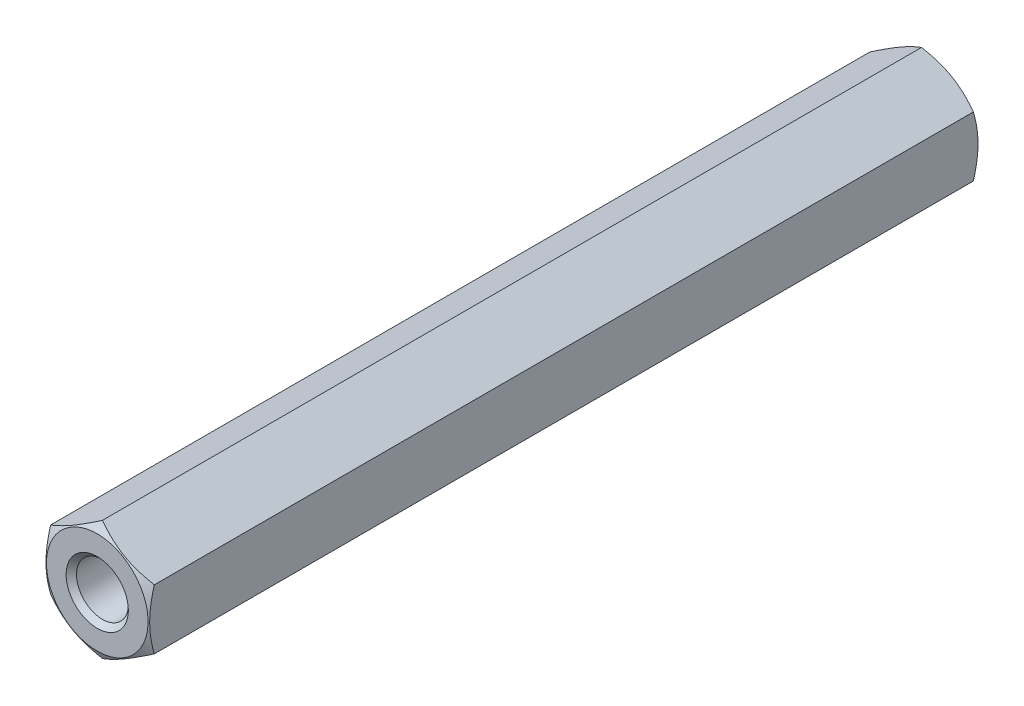
ISO-10303-21;
HEADER;
FILE_DESCRIPTION(('STEP AP214'),'2;1');
FILE_NAME('part.step','',(''),(''),'','','');
FILE_SCHEMA(('AUTOMOTIVE_DESIGN { 1 0 10303 214 1 1 1 1 }'));
ENDSEC;
DATA;
#1=APPLICATION_CONTEXT('core data for automotive mechanical design processes');
#2=APPLICATION_PROTOCOL_DEFINITION('international standard','automotive_design',2000,#1);
#3=PRODUCT_CONTEXT('',#1,'mechanical');
#4=PRODUCT('Part','Part','',(#3));
#5=PRODUCT_RELATED_PRODUCT_CATEGORY('part','',(#4));
#6=PRODUCT_DEFINITION_FORMATION('','',#4);
#7=PRODUCT_DEFINITION_CONTEXT('part definition',#1,'design');
#8=PRODUCT_DEFINITION('design','',#6,#7);
#9=PRODUCT_DEFINITION_SHAPE('','',#8);
#10=(LENGTH_UNIT() NAMED_UNIT(*) SI_UNIT(.MILLI.,.METRE.));
#11=(NAMED_UNIT(*) PLANE_ANGLE_UNIT() SI_UNIT($,.RADIAN.));
#12=(NAMED_UNIT(*) SI_UNIT($,.STERADIAN.) SOLID_ANGLE_UNIT());
#13=UNCERTAINTY_MEASURE_WITH_UNIT(LENGTH_MEASURE(1.E-05),#10,'distance_accuracy_value','');
#14=(GEOMETRIC_REPRESENTATION_CONTEXT(3) GLOBAL_UNCERTAINTY_ASSIGNED_CONTEXT((#13)) GLOBAL_UNIT_ASSIGNED_CONTEXT((#10,
#11,#12)) REPRESENTATION_CONTEXT('',''));
#15=CARTESIAN_POINT('',(0.,0.,0.));
#16=DIRECTION('',(0.,0.,1.));
#17=DIRECTION('',(1.,0.,0.));
#18=AXIS2_PLACEMENT_3D('',#15,#16,#17);
#19=CARTESIAN_POINT('',(0.,0.,0.));
#20=DIRECTION('',(0.,0.,1.));
#21=DIRECTION('',(1.,0.,0.));
#22=AXIS2_PLACEMENT_3D('',#19,#20,#21);
#23=PLANE('',#22);
#24=CARTESIAN_POINT('',(0.,0.,0.));
#25=DIRECTION('',(0.,0.,-1.));
#26=DIRECTION('',(1.,0.,0.));
#27=AXIS2_PLACEMENT_3D('',#24,#25,#26);
#28=CIRCLE('',#27,3.);
#29=CARTESIAN_POINT('',(3.,0.,0.));
#30=VERTEX_POINT('',#29);
#31=EDGE_CURVE('E177',#30,#30,#28,.T.);
#32=ORIENTED_EDGE('',*,*,#31,.T.);
#33=EDGE_LOOP('',(#32));
#34=FACE_BOUND('',#33,.T.);
#35=CARTESIAN_POINT('',(0.,0.,0.));
#36=DIRECTION('',(0.,0.,1.));
#37=DIRECTION('',(1.,0.,0.));
#38=AXIS2_PLACEMENT_3D('',#35,#36,#37);
#39=CIRCLE('',#38,4.9);
#40=CARTESIAN_POINT('',(-4.9,0.,0.));
#41=VERTEX_POINT('',#40);
#42=EDGE_CURVE('E169',#41,#41,#39,.T.);
#43=ORIENTED_EDGE('',*,*,#42,.T.);
#44=EDGE_LOOP('',(#43));
#45=FACE_BOUND('',#44,.T.);
#46=ADVANCED_FACE('F16',(#34,#45),#23,.T.);
#47=CARTESIAN_POINT('',(0.,5.77350269189626,-80.));
#48=DIRECTION('',(-0.5,0.866025403784439,0.));
#49=DIRECTION('',(0.,0.,1.));
#50=AXIS2_PLACEMENT_3D('',#47,#48,#49);
#51=PLANE('',#50);
#52=DIRECTION('',(0.,0.,1.));
#53=VECTOR('',#52,1.);
#54=CARTESIAN_POINT('',(-5.,2.88675134594813,-80.));
#55=LINE('',#54,#53);
#56=CARTESIAN_POINT('',(-5.,2.88675134594813,-79.4956829856958));
#57=VERTEX_POINT('',#56);
#58=CARTESIAN_POINT('',(-5.,2.88675134594813,-0.504317014304161));
#59=VERTEX_POINT('',#58);
#60=EDGE_CURVE('E11',#57,#59,#55,.T.);
#61=ORIENTED_EDGE('',*,*,#60,.T.);
#62=CARTESIAN_POINT('',(-5.,2.88675134594813,-0.504317014304201));
#63=CARTESIAN_POINT('',(-3.66306980544847,3.65862835366019,-0.0586736161190954));
#64=CARTESIAN_POINT('',(-2.50477576908249,4.32736972735683,-0.057736782676801));
#65=CARTESIAN_POINT('',(-1.88471942439267,4.68535942487623,-0.0572352783077962));
#66=CARTESIAN_POINT('',(-1.237931285487,5.05878273098208,-0.177851186469402));
#67=CARTESIAN_POINT('',(-0.651083691509377,5.39759934733835,-0.287289117133799));
#68=CARTESIAN_POINT('',(0.,5.77350269189626,-0.504317014304201));
#69=B_SPLINE_CURVE_WITH_KNOTS('',2,(#62,#63,#64,#65,#66,#67,#68),.UNSPECIFIED.,.F.,.F.,(3,2,2,
3),(0.,0.5,0.75,1.),.UNSPECIFIED.);
#70=CARTESIAN_POINT('',(0.,5.77350269189626,-0.504317014304161));
#71=VERTEX_POINT('',#70);
#72=EDGE_CURVE('E185',#59,#71,#69,.T.);
#73=ORIENTED_EDGE('',*,*,#72,.T.);
#74=DIRECTION('',(0.,0.,1.));
#75=VECTOR('',#74,1.);
#76=CARTESIAN_POINT('',(0.,5.77350269189626,-80.));
#77=LINE('',#76,#75);
#78=CARTESIAN_POINT('',(0.,5.77350269189626,-79.4956829856958));
#79=VERTEX_POINT('',#78);
#80=EDGE_CURVE('E45',#79,#71,#77,.T.);
#81=ORIENTED_EDGE('',*,*,#80,.F.);
#82=CARTESIAN_POINT('',(0.,5.77350269189626,-79.4956829856958));
#83=CARTESIAN_POINT('',(-1.33693019455178,5.00162568418405,-79.9413263838809));
#84=CARTESIAN_POINT('',(-2.49522423091751,4.33288431048756,-79.9422632173232));
#85=CARTESIAN_POINT('',(-3.11528057540677,3.97489461308395,-79.942764721692));
#86=CARTESIAN_POINT('',(-3.762068714513,3.60147130686231,-79.8221488135306));
#87=CARTESIAN_POINT('',(-4.34891630825725,3.26265469064078,-79.7127108829439));
#88=CARTESIAN_POINT('',(-5.,2.88675134594813,-79.4956829856958));
#89=B_SPLINE_CURVE_WITH_KNOTS('',2,(#82,#83,#84,#85,#86,#87,#88),.UNSPECIFIED.,.F.,.F.,(3,2,2,
3),(0.,0.5,0.75,1.),.UNSPECIFIED.);
#90=EDGE_CURVE('E387',#79,#57,#89,.T.);
#91=ORIENTED_EDGE('',*,*,#90,.T.);
#92=EDGE_LOOP('',(#61,#73,#81,#91));
#93=FACE_BOUND('',#92,.T.);
#94=ADVANCED_FACE('F303',(#93),#51,.T.);
#95=CARTESIAN_POINT('',(-5.,2.88675134594813,-80.));
#96=DIRECTION('',(-1.,0.,0.));
#97=DIRECTION('',(0.,0.,1.));
#98=AXIS2_PLACEMENT_3D('',#95,#96,#97);
#99=PLANE('',#98);
#100=DIRECTION('',(0.,0.,1.));
#101=VECTOR('',#100,1.);
#102=CARTESIAN_POINT('',(-5.,-2.88675134594813,-80.));
#103=LINE('',#102,#101);
#104=CARTESIAN_POINT('',(-5.,-2.88675134594813,-79.4956829856958));
#105=VERTEX_POINT('',#104);
#106=CARTESIAN_POINT('',(-5.,-2.88675134594813,-0.50431701430416));
#107=VERTEX_POINT('',#106);
#108=EDGE_CURVE('E30',#105,#107,#103,.T.);
#109=ORIENTED_EDGE('',*,*,#108,.T.);
#110=CARTESIAN_POINT('',(-5.,-2.88675134594813,-0.504317014304201));
#111=CARTESIAN_POINT('',(-5.,-2.13397543139319,-0.287009325850199));
#112=CARTESIAN_POINT('',(-5.,-1.4544658785629,-0.177391891882109));
#113=CARTESIAN_POINT('',(-5.,-0.712722709973745,-0.0577350269189009));
#114=CARTESIAN_POINT('',(-5.,0.,-0.0577350269189009));
#115=B_SPLINE_CURVE_WITH_KNOTS('',2,(#110,#111,#112,#113,#114),.UNSPECIFIED.,.F.,.F.,(3,2,3),
(0.,0.5,1.),.UNSPECIFIED.);
#116=CARTESIAN_POINT('',(-5.,0.,-0.0577350269189619));
#117=VERTEX_POINT('',#116);
#118=EDGE_CURVE('E325',#107,#117,#115,.T.);
#119=ORIENTED_EDGE('',*,*,#118,.T.);
#120=CARTESIAN_POINT('',(-5.,0.,-0.0577350269189009));
#121=CARTESIAN_POINT('',(-5.,0.71724152943844,-0.0577350269189009));
#122=CARTESIAN_POINT('',(-5.,1.46517966914249,-0.179125491838406));
#123=CARTESIAN_POINT('',(-5.,2.13921232145819,-0.288521085794607));
#124=CARTESIAN_POINT('',(-5.,2.88675134594813,-0.504317014304201));
#125=B_SPLINE_CURVE_WITH_KNOTS('',2,(#120,#121,#122,#123,#124),.UNSPECIFIED.,.F.,.F.,(3,2,3),
(0.,0.5,1.),.UNSPECIFIED.);
#126=EDGE_CURVE('E290',#117,#59,#125,.T.);
#127=ORIENTED_EDGE('',*,*,#126,.T.);
#128=ORIENTED_EDGE('',*,*,#60,.F.);
#129=CARTESIAN_POINT('',(-5.,2.88675134594813,-79.4956829856958));
#130=CARTESIAN_POINT('',(-5.,2.13980606328878,-79.7113075157026));
#131=CARTESIAN_POINT('',(-5.,1.46517966914249,-79.8208745081617));
#132=CARTESIAN_POINT('',(-5.,0.717753735525175,-79.9422649730811));
#133=CARTESIAN_POINT('',(-5.,0.,-79.9422649730811));
#134=B_SPLINE_CURVE_WITH_KNOTS('',2,(#129,#130,#131,#132,#133),.UNSPECIFIED.,.F.,.F.,(3,2,3),
(0.,0.5,1.),.UNSPECIFIED.);
#135=CARTESIAN_POINT('',(-5.,0.,-79.9422649730811));
#136=VERTEX_POINT('',#135);
#137=EDGE_CURVE('E726',#57,#136,#134,.T.);
#138=ORIENTED_EDGE('',*,*,#137,.T.);
#139=CARTESIAN_POINT('',(-5.,0.,-79.9422649730811));
#140=CARTESIAN_POINT('',(-5.,-0.71221031795662,-79.9422649730811));
#141=CARTESIAN_POINT('',(-5.,-1.45446587856291,-79.8226081081179));
#142=CARTESIAN_POINT('',(-5.,-2.13338178582431,-79.7131620448642));
#143=CARTESIAN_POINT('',(-5.,-2.88675134594813,-79.4956829856958));
#144=B_SPLINE_CURVE_WITH_KNOTS('',2,(#139,#140,#141,#142,#143),.UNSPECIFIED.,.F.,.F.,(3,2,3),
(0.,0.5,1.),.UNSPECIFIED.);
#145=EDGE_CURVE('E728',#136,#105,#144,.T.);
#146=ORIENTED_EDGE('',*,*,#145,.T.);
#147=EDGE_LOOP('',(#109,#119,#127,#128,#138,#146));
#148=FACE_BOUND('',#147,.T.);
#149=ADVANCED_FACE('F293',(#148),#99,.T.);
#150=CARTESIAN_POINT('',(-5.,-2.88675134594813,-80.));
#151=DIRECTION('',(-0.5,-0.866025403784439,0.));
#152=DIRECTION('',(-0.866025403784439,0.5,0.));
#153=AXIS2_PLACEMENT_3D('',#150,#151,#152);
#154=PLANE('',#153);
#155=DIRECTION('',(0.,0.,1.));
#156=VECTOR('',#155,1.);
#157=CARTESIAN_POINT('',(0.,-5.77350269189626,-80.));
#158=LINE('',#157,#156);
#159=CARTESIAN_POINT('',(0.,-5.77350269189626,-79.4956829856958));
#160=VERTEX_POINT('',#159);
#161=CARTESIAN_POINT('',(0.,-5.77350269189626,-0.504317014304161));
#162=VERTEX_POINT('',#161);
#163=EDGE_CURVE('E392',#160,#162,#158,.T.);
#164=ORIENTED_EDGE('',*,*,#163,.T.);
#165=CARTESIAN_POINT('',(0.,-5.77350269189626,-0.504317014304159));
#166=CARTESIAN_POINT('',(-1.33693019455152,-5.0016256841842,-0.0586736161190538));
#167=CARTESIAN_POINT('',(-2.49522423091751,-4.33288431048756,-0.0577367826767594));
#168=CARTESIAN_POINT('',(-3.11528057561013,-3.97489461296654,-0.0572352783077545));
#169=CARTESIAN_POINT('',(-3.762068714513,-3.60147130686231,-0.17785118646936));
#170=CARTESIAN_POINT('',(-4.34891630849387,-3.26265469050417,-0.287289117134853));
#171=CARTESIAN_POINT('',(-5.,-2.88675134594813,-0.504317014304159));
#172=B_SPLINE_CURVE_WITH_KNOTS('',2,(#165,#166,#167,#168,#169,#170,#171),.UNSPECIFIED.,.F.,.F.,
(3,2,2,3),(0.,0.5,0.75,1.),.UNSPECIFIED.);
#173=EDGE_CURVE('E330',#162,#107,#172,.T.);
#174=ORIENTED_EDGE('',*,*,#173,.T.);
#175=ORIENTED_EDGE('',*,*,#108,.F.);
#176=CARTESIAN_POINT('',(-5.,-2.88675134594813,-79.4956829856958));
#177=CARTESIAN_POINT('',(-3.66306980550131,-3.65862835362969,-79.9413263838634));
#178=CARTESIAN_POINT('',(-2.50477576908249,-4.32736972735683,-79.9422632173232));
#179=CARTESIAN_POINT('',(-1.88471942456989,-4.68535942477392,-79.9427647217014));
#180=CARTESIAN_POINT('',(-1.237931285487,-5.05878273098208,-79.8221488135306));
#181=CARTESIAN_POINT('',(-0.651083691656496,-5.3975993472534,-79.7127108829153));
#182=CARTESIAN_POINT('',(0.,-5.77350269189626,-79.4956829856958));
#183=B_SPLINE_CURVE_WITH_KNOTS('',2,(#176,#177,#178,#179,#180,#181,#182),.UNSPECIFIED.,.F.,.F.,
(3,2,2,3),(0.,0.5,0.75,1.),.UNSPECIFIED.);
#184=EDGE_CURVE('E735',#105,#160,#183,.T.);
#185=ORIENTED_EDGE('',*,*,#184,.T.);
#186=EDGE_LOOP('',(#164,#174,#175,#185));
#187=FACE_BOUND('',#186,.T.);
#188=ADVANCED_FACE('F302',(#187),#154,.T.);
#189=CARTESIAN_POINT('',(0.,-5.77350269189626,-80.));
#190=DIRECTION('',(0.5,-0.866025403784439,0.));
#191=DIRECTION('',(0.,0.,-1.));
#192=AXIS2_PLACEMENT_3D('',#189,#190,#191);
#193=PLANE('',#192);
#194=DIRECTION('',(0.,0.,1.));
#195=VECTOR('',#194,1.);
#196=CARTESIAN_POINT('',(5.,-2.88675134594813,-80.));
#197=LINE('',#196,#195);
#198=CARTESIAN_POINT('',(5.,-2.88675134594813,-79.4956829856958));
#199=VERTEX_POINT('',#198);
#200=CARTESIAN_POINT('',(5.,-2.88675134594813,-0.50431701430416));
#201=VERTEX_POINT('',#200);
#202=EDGE_CURVE('E396',#199,#201,#197,.T.);
#203=ORIENTED_EDGE('',*,*,#202,.T.);
#204=CARTESIAN_POINT('',(5.,-2.88675134594813,-0.504317014304201));
#205=CARTESIAN_POINT('',(3.66306980544847,-3.6586283536602,-0.0586736161190954));
#206=CARTESIAN_POINT('',(2.50477576908249,-4.32736972735683,-0.057736782676801));
#207=CARTESIAN_POINT('',(1.88471942438946,-4.68535942487809,-0.0572352783077962));
#208=CARTESIAN_POINT('',(1.237931285487,-5.05878273098208,-0.177851186469402));
#209=CARTESIAN_POINT('',(0.651083691505648,-5.3975993473405,-0.287289117134992));
#210=CARTESIAN_POINT('',(0.,-5.77350269189626,-0.504317014304201));
#211=B_SPLINE_CURVE_WITH_KNOTS('',2,(#204,#205,#206,#207,#208,#209,#210),.UNSPECIFIED.,.F.,.F.,
(3,2,2,3),(0.,0.5,0.75,1.),.UNSPECIFIED.);
#212=EDGE_CURVE('E870',#201,#162,#211,.T.);
#213=ORIENTED_EDGE('',*,*,#212,.T.);
#214=ORIENTED_EDGE('',*,*,#163,.F.);
#215=CARTESIAN_POINT('',(0.,-5.77350269189626,-79.4956829856958));
#216=CARTESIAN_POINT('',(1.3369301945518,-5.00162568418404,-79.9413263838809));
#217=CARTESIAN_POINT('',(2.49522423091751,-4.33288431048756,-79.9422632173232));
#218=CARTESIAN_POINT('',(3.11528057545602,-3.97489461305551,-79.942764721692));
#219=CARTESIAN_POINT('',(3.762068714513,-3.60147130686231,-79.8221488135306));
#220=CARTESIAN_POINT('',(4.34891630831441,-3.26265469060778,-79.7127108829249));
#221=CARTESIAN_POINT('',(5.,-2.88675134594813,-79.4956829856958));
#222=B_SPLINE_CURVE_WITH_KNOTS('',2,(#215,#216,#217,#218,#219,#220,#221),.UNSPECIFIED.,.F.,.F.,
(3,2,2,3),(0.,0.5,0.75,1.),.UNSPECIFIED.);
#223=EDGE_CURVE('E839',#160,#199,#222,.T.);
#224=ORIENTED_EDGE('',*,*,#223,.T.);
#225=EDGE_LOOP('',(#203,#213,#214,#224));
#226=FACE_BOUND('',#225,.T.);
#227=ADVANCED_FACE('F18',(#226),#193,.T.);
#228=CARTESIAN_POINT('',(5.,-2.88675134594813,-80.));
#229=DIRECTION('',(1.,0.,0.));
#230=DIRECTION('',(0.,1.,0.));
#231=AXIS2_PLACEMENT_3D('',#228,#229,#230);
#232=PLANE('',#231);
#233=DIRECTION('',(0.,0.,1.));
#234=VECTOR('',#233,1.);
#235=CARTESIAN_POINT('',(5.,2.88675134594813,-80.));
#236=LINE('',#235,#234);
#237=CARTESIAN_POINT('',(5.,2.88675134594813,-79.4956829856958));
#238=VERTEX_POINT('',#237);
#239=CARTESIAN_POINT('',(5.,2.88675134594813,-0.50431701430416));
#240=VERTEX_POINT('',#239);
#241=EDGE_CURVE('E105',#238,#240,#236,.T.);
#242=ORIENTED_EDGE('',*,*,#241,.T.);
#243=CARTESIAN_POINT('',(5.,2.88675134594813,-0.504317014304201));
#244=CARTESIAN_POINT('',(5.,2.13980606328883,-0.288692484297512));
#245=CARTESIAN_POINT('',(5.,1.46517966914249,-0.179125491838406));
#246=CARTESIAN_POINT('',(5.,0.717753735525955,-0.0577350269189009));
#247=CARTESIAN_POINT('',(5.,0.,-0.0577350269189009));
#248=B_SPLINE_CURVE_WITH_KNOTS('',2,(#243,#244,#245,#246,#247),.UNSPECIFIED.,.F.,.F.,(3,2,3),
(0.,0.5,1.),.UNSPECIFIED.);
#249=CARTESIAN_POINT('',(5.,0.,-0.0577350269189609));
#250=VERTEX_POINT('',#249);
#251=EDGE_CURVE('E861',#240,#250,#248,.T.);
#252=ORIENTED_EDGE('',*,*,#251,.T.);
#253=CARTESIAN_POINT('',(5.,0.,-0.0577350269189009));
#254=CARTESIAN_POINT('',(5.,-0.71221031801662,-0.0577350269189009));
#255=CARTESIAN_POINT('',(5.,-1.45446587856291,-0.177391891882109));
#256=CARTESIAN_POINT('',(5.,-2.13338178589357,-0.286837955155703));
#257=CARTESIAN_POINT('',(5.,-2.88675134594813,-0.504317014304201));
#258=B_SPLINE_CURVE_WITH_KNOTS('',2,(#253,#254,#255,#256,#257),.UNSPECIFIED.,.F.,.F.,(3,2,3),
(0.,0.5,1.),.UNSPECIFIED.);
#259=EDGE_CURVE('E865',#250,#201,#258,.T.);
#260=ORIENTED_EDGE('',*,*,#259,.T.);
#261=ORIENTED_EDGE('',*,*,#202,.F.);
#262=CARTESIAN_POINT('',(5.,-2.88675134594813,-79.4956829856958));
#263=CARTESIAN_POINT('',(5.,-2.13397543146092,-79.7129906741301));
#264=CARTESIAN_POINT('',(5.,-1.45446587856291,-79.822608108118));
#265=CARTESIAN_POINT('',(5.,-0.712722710032705,-79.9422649730811));
#266=CARTESIAN_POINT('',(5.,0.,-79.9422649730811));
#267=B_SPLINE_CURVE_WITH_KNOTS('',2,(#262,#263,#264,#265,#266),.UNSPECIFIED.,.F.,.F.,(3,2,3),
(0.,0.5,1.),.UNSPECIFIED.);
#268=CARTESIAN_POINT('',(5.,0.,-79.9422649730811));
#269=VERTEX_POINT('',#268);
#270=EDGE_CURVE('E116',#199,#269,#267,.T.);
#271=ORIENTED_EDGE('',*,*,#270,.T.);
#272=CARTESIAN_POINT('',(5.,0.,-79.9422649730811));
#273=CARTESIAN_POINT('',(5.,0.7172415294982,-79.9422649730811));
#274=CARTESIAN_POINT('',(5.,1.46517966914249,-79.8208745081617));
#275=CARTESIAN_POINT('',(5.,2.13921232152814,-79.7114789141853));
#276=CARTESIAN_POINT('',(5.,2.88675134594813,-79.4956829856958));
#277=B_SPLINE_CURVE_WITH_KNOTS('',2,(#272,#273,#274,#275,#276),.UNSPECIFIED.,.F.,.F.,(3,2,3),
(0.,0.5,1.),.UNSPECIFIED.);
#278=EDGE_CURVE('E184',#269,#238,#277,.T.);
#279=ORIENTED_EDGE('',*,*,#278,.T.);
#280=EDGE_LOOP('',(#242,#252,#260,#261,#271,#279));
#281=FACE_BOUND('',#280,.T.);
#282=ADVANCED_FACE('F206',(#281),#232,.T.);
#283=CARTESIAN_POINT('',(5.,2.88675134594813,-80.));
#284=DIRECTION('',(0.5,0.866025403784439,0.));
#285=DIRECTION('',(0.,0.,-1.));
#286=AXIS2_PLACEMENT_3D('',#283,#284,#285);
#287=PLANE('',#286);
#288=ORIENTED_EDGE('',*,*,#80,.T.);
#289=CARTESIAN_POINT('',(0.,5.77350269189626,-0.504317014304201));
#290=CARTESIAN_POINT('',(1.33693019455151,5.0016256841842,-0.0586736161190954));
#291=CARTESIAN_POINT('',(2.49522423091751,4.33288431048756,-0.057736782676801));
#292=CARTESIAN_POINT('',(3.11528057560999,3.97489461296662,-0.0572352783077962));
#293=CARTESIAN_POINT('',(3.76206871451299,3.60147130686231,-0.177851186469402));
#294=CARTESIAN_POINT('',(4.34891630849372,3.26265469050425,-0.287289117134798));
#295=CARTESIAN_POINT('',(5.,2.88675134594813,-0.504317014304201));
#296=B_SPLINE_CURVE_WITH_KNOTS('',2,(#289,#290,#291,#292,#293,#294,#295),.UNSPECIFIED.,.F.,.F.,
(3,2,2,3),(0.,0.5,0.75,1.),.UNSPECIFIED.);
#297=EDGE_CURVE('E228',#71,#240,#296,.T.);
#298=ORIENTED_EDGE('',*,*,#297,.T.);
#299=ORIENTED_EDGE('',*,*,#241,.F.);
#300=CARTESIAN_POINT('',(5.,2.88675134594813,-79.4956829856958));
#301=CARTESIAN_POINT('',(3.66306980544817,3.65862835366037,-79.9413263838809));
#302=CARTESIAN_POINT('',(2.50477576908249,4.32736972735683,-79.9422632173232));
#303=CARTESIAN_POINT('',(1.88471942450105,4.68535942481366,-79.9427647216921));
#304=CARTESIAN_POINT('',(1.237931285487,5.05878273098208,-79.8221488135306));
#305=CARTESIAN_POINT('',(0.651083691634758,5.39759934726596,-79.7127108829081));
#306=CARTESIAN_POINT('',(0.,5.77350269189626,-79.4956829856958));
#307=B_SPLINE_CURVE_WITH_KNOTS('',2,(#300,#301,#302,#303,#304,#305,#306),.UNSPECIFIED.,.F.,.F.,
(3,2,2,3),(0.,0.5,0.75,1.),.UNSPECIFIED.);
#308=EDGE_CURVE('E188',#238,#79,#307,.T.);
#309=ORIENTED_EDGE('',*,*,#308,.T.);
#310=EDGE_LOOP('',(#288,#298,#299,#309));
#311=FACE_BOUND('',#310,.T.);
#312=ADVANCED_FACE('F195',(#311),#287,.T.);
#313=CARTESIAN_POINT('',(0.,0.,-80.));
#314=DIRECTION('',(0.,0.,1.));
#315=DIRECTION('',(1.,0.,0.));
#316=AXIS2_PLACEMENT_3D('',#313,#314,#315);
#317=PLANE('',#316);
#318=CARTESIAN_POINT('',(0.,0.,-80.));
#319=DIRECTION('',(0.,0.,1.));
#320=DIRECTION('',(1.,0.,0.));
#321=AXIS2_PLACEMENT_3D('',#318,#319,#320);
#322=CIRCLE('',#321,3.);
#323=CARTESIAN_POINT('',(-3.,0.,-80.));
#324=VERTEX_POINT('',#323);
#325=EDGE_CURVE('E163',#324,#324,#322,.T.);
#326=ORIENTED_EDGE('',*,*,#325,.T.);
#327=EDGE_LOOP('',(#326));
#328=FACE_BOUND('',#327,.T.);
#329=CARTESIAN_POINT('',(0.,0.,-80.));
#330=DIRECTION('',(0.,0.,1.));
#331=DIRECTION('',(1.,0.,0.));
#332=AXIS2_PLACEMENT_3D('',#329,#330,#331);
#333=CIRCLE('',#332,4.9);
#334=CARTESIAN_POINT('',(-4.9,0.,-80.));
#335=VERTEX_POINT('',#334);
#336=EDGE_CURVE('E182',#335,#335,#333,.T.);
#337=ORIENTED_EDGE('',*,*,#336,.F.);
#338=EDGE_LOOP('',(#337));
#339=FACE_BOUND('',#338,.T.);
#340=ADVANCED_FACE('F205',(#328,#339),#317,.F.);
#341=CARTESIAN_POINT('',(0.,0.,-78.8452994616208));
#342=DIRECTION('',(0.,0.,1.));
#343=DIRECTION('',(1.,0.,0.));
#344=AXIS2_PLACEMENT_3D('',#341,#342,#343);
#345=CONICAL_SURFACE('',#344,6.9,1.0471975511966);
#346=ORIENTED_EDGE('',*,*,#278,.F.);
#347=ORIENTED_EDGE('',*,*,#270,.F.);
#348=ORIENTED_EDGE('',*,*,#223,.F.);
#349=ORIENTED_EDGE('',*,*,#184,.F.);
#350=ORIENTED_EDGE('',*,*,#145,.F.);
#351=ORIENTED_EDGE('',*,*,#137,.F.);
#352=ORIENTED_EDGE('',*,*,#90,.F.);
#353=ORIENTED_EDGE('',*,*,#308,.F.);
#354=EDGE_LOOP('',(#346,#347,#348,#349,#350,#351,#352,#353));
#355=FACE_BOUND('',#354,.T.);
#356=ORIENTED_EDGE('',*,*,#336,.T.);
#357=EDGE_LOOP('',(#356));
#358=FACE_BOUND('',#357,.T.);
#359=ADVANCED_FACE('F242',(#355,#358),#345,.T.);
#360=CARTESIAN_POINT('',(0.,0.,0.));
#361=DIRECTION('',(0.,0.,-1.));
#362=DIRECTION('',(-1.,0.,0.));
#363=AXIS2_PLACEMENT_3D('',#360,#361,#362);
#364=CONICAL_SURFACE('',#363,4.9,1.0471975511966);
#365=ORIENTED_EDGE('',*,*,#126,.F.);
#366=ORIENTED_EDGE('',*,*,#118,.F.);
#367=ORIENTED_EDGE('',*,*,#173,.F.);
#368=ORIENTED_EDGE('',*,*,#212,.F.);
#369=ORIENTED_EDGE('',*,*,#259,.F.);
#370=ORIENTED_EDGE('',*,*,#251,.F.);
#371=ORIENTED_EDGE('',*,*,#297,.F.);
#372=ORIENTED_EDGE('',*,*,#72,.F.);
#373=EDGE_LOOP('',(#365,#366,#367,#368,#369,#370,#371,#372));
#374=FACE_BOUND('',#373,.T.);
#375=ORIENTED_EDGE('',*,*,#42,.F.);
#376=EDGE_LOOP('',(#375));
#377=FACE_BOUND('',#376,.T.);
#378=ADVANCED_FACE('F233',(#374,#377),#364,.T.);
#379=CARTESIAN_POINT('',(0.,0.,-17.1));
#380=DIRECTION('',(0.,0.,1.));
#381=DIRECTION('',(1.,0.,0.));
#382=AXIS2_PLACEMENT_3D('',#379,#380,#381);
#383=CONICAL_SURFACE('',#382,2.5,1.02974425867666);
#384=CARTESIAN_POINT('',(0.,0.,-18.6021515475689));
#385=VERTEX_POINT('',#384);
#386=VERTEX_LOOP('',#385);
#387=FACE_BOUND('',#386,.T.);
#388=CARTESIAN_POINT('',(0.,0.,-17.1));
#389=DIRECTION('',(0.,0.,1.));
#390=DIRECTION('',(1.,0.,0.));
#391=AXIS2_PLACEMENT_3D('',#388,#389,#390);
#392=CIRCLE('',#391,2.5);
#393=CARTESIAN_POINT('',(2.5,0.,-17.1));
#394=VERTEX_POINT('',#393);
#395=EDGE_CURVE('E162',#394,#394,#392,.T.);
#396=ORIENTED_EDGE('',*,*,#395,.T.);
#397=EDGE_LOOP('',(#396));
#398=FACE_BOUND('',#397,.T.);
#399=ADVANCED_FACE('F209',(#387,#398),#383,.F.);
#400=CARTESIAN_POINT('',(0.,0.,0.));
#401=DIRECTION('',(0.,0.,-1.));
#402=DIRECTION('',(1.,0.,0.));
#403=AXIS2_PLACEMENT_3D('',#400,#401,#402);
#404=CYLINDRICAL_SURFACE('',#403,2.5);
#405=CARTESIAN_POINT('',(0.,0.,-0.5));
#406=DIRECTION('',(0.,0.,1.));
#407=DIRECTION('',(1.,0.,0.));
#408=AXIS2_PLACEMENT_3D('',#405,#406,#407);
#409=CIRCLE('',#408,2.5);
#410=CARTESIAN_POINT('',(2.5,0.,-0.5));
#411=VERTEX_POINT('',#410);
#412=EDGE_CURVE('E174',#411,#411,#409,.T.);
#413=ORIENTED_EDGE('',*,*,#412,.T.);
#414=EDGE_LOOP('',(#413));
#415=FACE_BOUND('',#414,.T.);
#416=ORIENTED_EDGE('',*,*,#395,.F.);
#417=EDGE_LOOP('',(#416));
#418=FACE_BOUND('',#417,.T.);
#419=ADVANCED_FACE('F304',(#415,#418),#404,.F.);
#420=CARTESIAN_POINT('',(0.,0.,-62.9));
#421=DIRECTION('',(0.,0.,-1.));
#422=DIRECTION('',(-1.,0.,0.));
#423=AXIS2_PLACEMENT_3D('',#420,#421,#422);
#424=CONICAL_SURFACE('',#423,2.5,1.02974425867666);
#425=CARTESIAN_POINT('',(0.,0.,-61.3978484524311));
#426=VERTEX_POINT('',#425);
#427=VERTEX_LOOP('',#426);
#428=FACE_BOUND('',#427,.T.);
#429=CARTESIAN_POINT('',(0.,0.,-62.9));
#430=DIRECTION('',(0.,0.,-1.));
#431=DIRECTION('',(-1.,0.,0.));
#432=AXIS2_PLACEMENT_3D('',#429,#430,#431);
#433=CIRCLE('',#432,2.5);
#434=CARTESIAN_POINT('',(-2.5,0.,-62.9));
#435=VERTEX_POINT('',#434);
#436=EDGE_CURVE('E158',#435,#435,#433,.T.);
#437=ORIENTED_EDGE('',*,*,#436,.T.);
#438=EDGE_LOOP('',(#437));
#439=FACE_BOUND('',#438,.T.);
#440=ADVANCED_FACE('F159',(#428,#439),#424,.F.);
#441=CARTESIAN_POINT('',(0.,0.,-80.));
#442=DIRECTION('',(0.,0.,1.));
#443=DIRECTION('',(-1.,0.,0.));
#444=AXIS2_PLACEMENT_3D('',#441,#442,#443);
#445=CYLINDRICAL_SURFACE('',#444,2.5);
#446=CARTESIAN_POINT('',(0.,0.,-79.5));
#447=DIRECTION('',(0.,0.,-1.));
#448=DIRECTION('',(1.,0.,0.));
#449=AXIS2_PLACEMENT_3D('',#446,#447,#448);
#450=CIRCLE('',#449,2.5);
#451=CARTESIAN_POINT('',(-2.5,0.,-79.5));
#452=VERTEX_POINT('',#451);
#453=EDGE_CURVE('E171',#452,#452,#450,.T.);
#454=ORIENTED_EDGE('',*,*,#453,.T.);
#455=EDGE_LOOP('',(#454));
#456=FACE_BOUND('',#455,.T.);
#457=ORIENTED_EDGE('',*,*,#436,.F.);
#458=EDGE_LOOP('',(#457));
#459=FACE_BOUND('',#458,.T.);
#460=ADVANCED_FACE('F479',(#456,#459),#445,.F.);
#461=CARTESIAN_POINT('',(0.,0.,-79.5));
#462=DIRECTION('',(0.,0.,-1.));
#463=DIRECTION('',(-1.,0.,0.));
#464=AXIS2_PLACEMENT_3D('',#461,#462,#463);
#465=CONICAL_SURFACE('',#464,2.5,0.785398163397431);
#466=ORIENTED_EDGE('',*,*,#325,.F.);
#467=EDGE_LOOP('',(#466));
#468=FACE_BOUND('',#467,.T.);
#469=ORIENTED_EDGE('',*,*,#453,.F.);
#470=EDGE_LOOP('',(#469));
#471=FACE_BOUND('',#470,.T.);
#472=ADVANCED_FACE('F348',(#468,#471),#465,.F.);
#473=CARTESIAN_POINT('',(0.,0.,-0.5));
#474=DIRECTION('',(0.,0.,1.));
#475=DIRECTION('',(1.,0.,0.));
#476=AXIS2_PLACEMENT_3D('',#473,#474,#475);
#477=CONICAL_SURFACE('',#476,2.5,0.785398163397447);
#478=ORIENTED_EDGE('',*,*,#31,.F.);
#479=EDGE_LOOP('',(#478));
#480=FACE_BOUND('',#479,.T.);
#481=ORIENTED_EDGE('',*,*,#412,.F.);
#482=EDGE_LOOP('',(#481));
#483=FACE_BOUND('',#482,.T.);
#484=ADVANCED_FACE('F207',(#480,#483),#477,.F.);
#485=CLOSED_SHELL('',(#46,#94,#149,#188,#227,#282,#312,#340,#359,#378,#399,#419,#440,#460,#472,#484));
#486=MANIFOLD_SOLID_BREP('B1',#485);
#487=ADVANCED_BREP_SHAPE_REPRESENTATION('',(#18,#486),#14);
#488=SHAPE_DEFINITION_REPRESENTATION(#9,#487);
ENDSEC;
END-ISO-10303-21;
